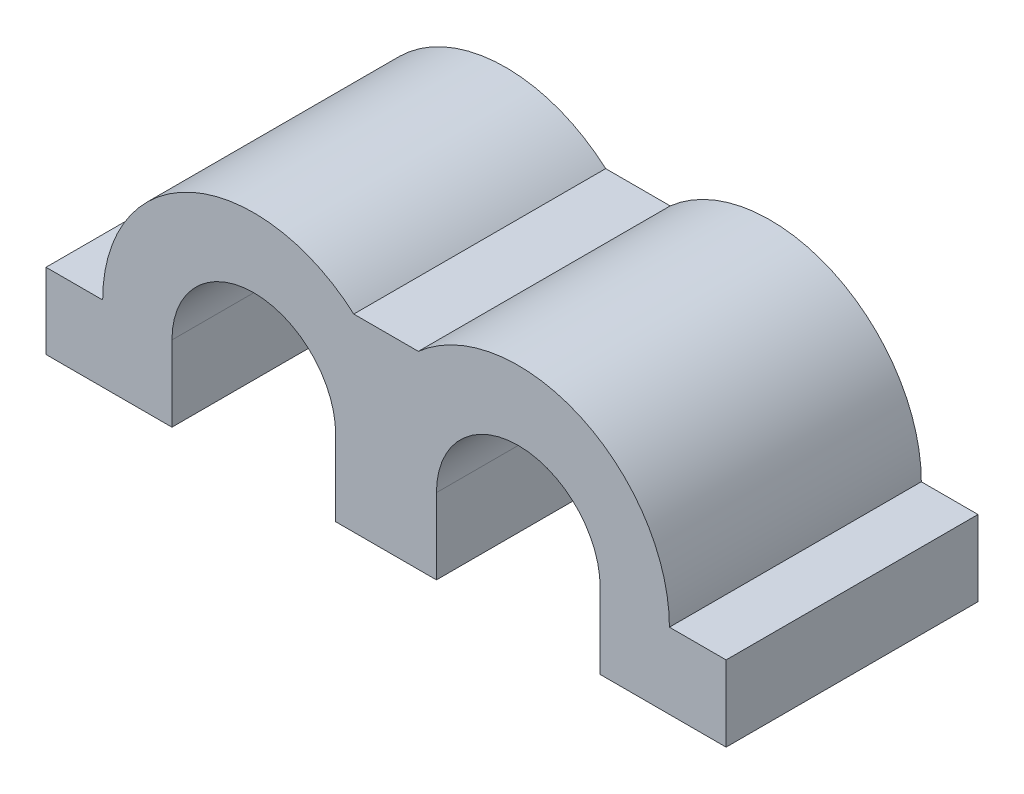
ISO-10303-21;
HEADER;
FILE_DESCRIPTION(('STEP AP214'),'2;1');
FILE_NAME('part.step','',(''),(''),'','','');
FILE_SCHEMA(('AUTOMOTIVE_DESIGN { 1 0 10303 214 1 1 1 1 }'));
ENDSEC;
DATA;
#1=APPLICATION_CONTEXT('core data for automotive mechanical design processes');
#2=APPLICATION_PROTOCOL_DEFINITION('international standard','automotive_design',2000,#1);
#3=PRODUCT_CONTEXT('',#1,'mechanical');
#4=PRODUCT('Part','Part','',(#3));
#5=PRODUCT_RELATED_PRODUCT_CATEGORY('part','',(#4));
#6=PRODUCT_DEFINITION_FORMATION('','',#4);
#7=PRODUCT_DEFINITION_CONTEXT('part definition',#1,'design');
#8=PRODUCT_DEFINITION('design','',#6,#7);
#9=PRODUCT_DEFINITION_SHAPE('','',#8);
#10=(LENGTH_UNIT() NAMED_UNIT(*) SI_UNIT(.MILLI.,.METRE.));
#11=(NAMED_UNIT(*) PLANE_ANGLE_UNIT() SI_UNIT($,.RADIAN.));
#12=(NAMED_UNIT(*) SI_UNIT($,.STERADIAN.) SOLID_ANGLE_UNIT());
#13=UNCERTAINTY_MEASURE_WITH_UNIT(LENGTH_MEASURE(1.E-05),#10,'distance_accuracy_value','');
#14=(GEOMETRIC_REPRESENTATION_CONTEXT(3) GLOBAL_UNCERTAINTY_ASSIGNED_CONTEXT((#13)) GLOBAL_UNIT_ASSIGNED_CONTEXT((#10,
#11,#12)) REPRESENTATION_CONTEXT('',''));
#15=CARTESIAN_POINT('',(0.,0.,0.));
#16=DIRECTION('',(0.,0.,1.));
#17=DIRECTION('',(1.,0.,0.));
#18=AXIS2_PLACEMENT_3D('',#15,#16,#17);
#19=CARTESIAN_POINT('',(5.25,0.,10.));
#20=DIRECTION('',(0.,0.,-1.));
#21=DIRECTION('',(-1.,0.,0.));
#22=AXIS2_PLACEMENT_3D('',#19,#20,#21);
#23=CYLINDRICAL_SURFACE('',#22,6.);
#24=CARTESIAN_POINT('',(5.25,0.,0.));
#25=DIRECTION('',(0.,0.,1.));
#26=DIRECTION('',(1.,0.,0.));
#27=AXIS2_PLACEMENT_3D('',#24,#25,#26);
#28=CIRCLE('',#27,6.);
#29=CARTESIAN_POINT('',(1.28137303340311,4.5,0.));
#30=VERTEX_POINT('',#29);
#31=CARTESIAN_POINT('',(11.25,0.,0.));
#32=VERTEX_POINT('',#31);
#33=EDGE_CURVE('E180',#30,#32,#28,.F.);
#34=ORIENTED_EDGE('',*,*,#33,.F.);
#35=DIRECTION('',(0.,0.,-1.));
#36=VECTOR('',#35,1.);
#37=CARTESIAN_POINT('',(1.28137303340311,4.5,10.));
#38=LINE('',#37,#36);
#39=CARTESIAN_POINT('',(1.28137303340311,4.5,10.));
#40=VERTEX_POINT('',#39);
#41=EDGE_CURVE('E11',#40,#30,#38,.T.);
#42=ORIENTED_EDGE('',*,*,#41,.F.);
#43=CARTESIAN_POINT('',(5.25,0.,10.));
#44=DIRECTION('',(0.,0.,1.));
#45=DIRECTION('',(1.,0.,0.));
#46=AXIS2_PLACEMENT_3D('',#43,#44,#45);
#47=CIRCLE('',#46,6.);
#48=CARTESIAN_POINT('',(11.25,0.,10.));
#49=VERTEX_POINT('',#48);
#50=EDGE_CURVE('E217',#40,#49,#47,.F.);
#51=ORIENTED_EDGE('',*,*,#50,.T.);
#52=DIRECTION('',(0.,0.,-1.));
#53=VECTOR('',#52,1.);
#54=CARTESIAN_POINT('',(11.25,0.,10.));
#55=LINE('',#54,#53);
#56=EDGE_CURVE('E55',#49,#32,#55,.T.);
#57=ORIENTED_EDGE('',*,*,#56,.T.);
#58=EDGE_LOOP('',(#34,#42,#51,#57));
#59=FACE_BOUND('',#58,.T.);
#60=ADVANCED_FACE('F39',(#59),#23,.T.);
#61=CARTESIAN_POINT('',(0.,4.5,10.));
#62=DIRECTION('',(0.,1.,0.));
#63=DIRECTION('',(0.,0.,1.));
#64=AXIS2_PLACEMENT_3D('',#61,#62,#63);
#65=PLANE('',#64);
#66=DIRECTION('',(1.,0.,0.));
#67=VECTOR('',#66,1.);
#68=CARTESIAN_POINT('',(0.,4.5,0.));
#69=LINE('',#68,#67);
#70=CARTESIAN_POINT('',(-1.28137303340311,4.5,0.));
#71=VERTEX_POINT('',#70);
#72=EDGE_CURVE('E182',#71,#30,#69,.T.);
#73=ORIENTED_EDGE('',*,*,#72,.F.);
#74=DIRECTION('',(0.,0.,-1.));
#75=VECTOR('',#74,1.);
#76=CARTESIAN_POINT('',(-1.28137303340311,4.5,10.));
#77=LINE('',#76,#75);
#78=CARTESIAN_POINT('',(-1.28137303340311,4.5,10.));
#79=VERTEX_POINT('',#78);
#80=EDGE_CURVE('E47',#79,#71,#77,.T.);
#81=ORIENTED_EDGE('',*,*,#80,.F.);
#82=DIRECTION('',(1.,0.,0.));
#83=VECTOR('',#82,1.);
#84=CARTESIAN_POINT('',(0.,4.5,10.));
#85=LINE('',#84,#83);
#86=EDGE_CURVE('E261',#79,#40,#85,.T.);
#87=ORIENTED_EDGE('',*,*,#86,.T.);
#88=ORIENTED_EDGE('',*,*,#41,.T.);
#89=EDGE_LOOP('',(#73,#81,#87,#88));
#90=FACE_BOUND('',#89,.T.);
#91=ADVANCED_FACE('F260',(#90),#65,.T.);
#92=CARTESIAN_POINT('',(-5.25,0.,10.));
#93=DIRECTION('',(0.,0.,-1.));
#94=DIRECTION('',(-1.,0.,0.));
#95=AXIS2_PLACEMENT_3D('',#92,#93,#94);
#96=CYLINDRICAL_SURFACE('',#95,6.);
#97=CARTESIAN_POINT('',(-5.25,0.,0.));
#98=DIRECTION('',(0.,0.,1.));
#99=DIRECTION('',(1.,0.,0.));
#100=AXIS2_PLACEMENT_3D('',#97,#98,#99);
#101=CIRCLE('',#100,6.);
#102=CARTESIAN_POINT('',(-11.25,0.,0.));
#103=VERTEX_POINT('',#102);
#104=EDGE_CURVE('E185',#71,#103,#101,.T.);
#105=ORIENTED_EDGE('',*,*,#104,.T.);
#106=DIRECTION('',(0.,0.,-1.));
#107=VECTOR('',#106,1.);
#108=CARTESIAN_POINT('',(-11.25,0.,10.));
#109=LINE('',#108,#107);
#110=CARTESIAN_POINT('',(-11.25,0.,10.));
#111=VERTEX_POINT('',#110);
#112=EDGE_CURVE('E245',#111,#103,#109,.T.);
#113=ORIENTED_EDGE('',*,*,#112,.F.);
#114=CARTESIAN_POINT('',(-5.25,0.,10.));
#115=DIRECTION('',(0.,0.,1.));
#116=DIRECTION('',(1.,0.,0.));
#117=AXIS2_PLACEMENT_3D('',#114,#115,#116);
#118=CIRCLE('',#117,6.);
#119=EDGE_CURVE('E251',#79,#111,#118,.T.);
#120=ORIENTED_EDGE('',*,*,#119,.F.);
#121=ORIENTED_EDGE('',*,*,#80,.T.);
#122=EDGE_LOOP('',(#105,#113,#120,#121));
#123=FACE_BOUND('',#122,.T.);
#124=ADVANCED_FACE('F249',(#123),#96,.T.);
#125=CARTESIAN_POINT('',(0.,0.,10.));
#126=DIRECTION('',(0.,1.,0.));
#127=DIRECTION('',(0.,0.,1.));
#128=AXIS2_PLACEMENT_3D('',#125,#126,#127);
#129=PLANE('',#128);
#130=DIRECTION('',(1.,0.,0.));
#131=VECTOR('',#130,1.);
#132=CARTESIAN_POINT('',(0.,0.,0.));
#133=LINE('',#132,#131);
#134=CARTESIAN_POINT('',(-13.5,0.,0.));
#135=VERTEX_POINT('',#134);
#136=EDGE_CURVE('E188',#135,#103,#133,.T.);
#137=ORIENTED_EDGE('',*,*,#136,.F.);
#138=DIRECTION('',(0.,0.,-1.));
#139=VECTOR('',#138,1.);
#140=CARTESIAN_POINT('',(-13.5,0.,10.));
#141=LINE('',#140,#139);
#142=CARTESIAN_POINT('',(-13.5,0.,10.));
#143=VERTEX_POINT('',#142);
#144=EDGE_CURVE('E243',#143,#135,#141,.T.);
#145=ORIENTED_EDGE('',*,*,#144,.F.);
#146=DIRECTION('',(1.,0.,0.));
#147=VECTOR('',#146,1.);
#148=CARTESIAN_POINT('',(0.,0.,10.));
#149=LINE('',#148,#147);
#150=EDGE_CURVE('E468',#143,#111,#149,.T.);
#151=ORIENTED_EDGE('',*,*,#150,.T.);
#152=ORIENTED_EDGE('',*,*,#112,.T.);
#153=EDGE_LOOP('',(#137,#145,#151,#152));
#154=FACE_BOUND('',#153,.T.);
#155=ADVANCED_FACE('F279',(#154),#129,.T.);
#156=CARTESIAN_POINT('',(-13.5,0.,10.));
#157=DIRECTION('',(1.,0.,0.));
#158=DIRECTION('',(0.,0.,-1.));
#159=AXIS2_PLACEMENT_3D('',#156,#157,#158);
#160=PLANE('',#159);
#161=DIRECTION('',(0.,-1.,0.));
#162=VECTOR('',#161,1.);
#163=CARTESIAN_POINT('',(-13.5,0.,0.));
#164=LINE('',#163,#162);
#165=CARTESIAN_POINT('',(-13.5,-3.,0.));
#166=VERTEX_POINT('',#165);
#167=EDGE_CURVE('E191',#135,#166,#164,.T.);
#168=ORIENTED_EDGE('',*,*,#167,.T.);
#169=DIRECTION('',(0.,0.,-1.));
#170=VECTOR('',#169,1.);
#171=CARTESIAN_POINT('',(-13.5,-3.,10.));
#172=LINE('',#171,#170);
#173=CARTESIAN_POINT('',(-13.5,-3.,10.));
#174=VERTEX_POINT('',#173);
#175=EDGE_CURVE('E240',#174,#166,#172,.T.);
#176=ORIENTED_EDGE('',*,*,#175,.F.);
#177=DIRECTION('',(0.,-1.,0.));
#178=VECTOR('',#177,1.);
#179=CARTESIAN_POINT('',(-13.5,0.,10.));
#180=LINE('',#179,#178);
#181=EDGE_CURVE('E465',#143,#174,#180,.T.);
#182=ORIENTED_EDGE('',*,*,#181,.F.);
#183=ORIENTED_EDGE('',*,*,#144,.T.);
#184=EDGE_LOOP('',(#168,#176,#182,#183));
#185=FACE_BOUND('',#184,.T.);
#186=ADVANCED_FACE('F284',(#185),#160,.F.);
#187=CARTESIAN_POINT('',(0.,-3.,10.));
#188=DIRECTION('',(0.,1.,0.));
#189=DIRECTION('',(0.,0.,1.));
#190=AXIS2_PLACEMENT_3D('',#187,#188,#189);
#191=PLANE('',#190);
#192=DIRECTION('',(1.,0.,0.));
#193=VECTOR('',#192,1.);
#194=CARTESIAN_POINT('',(0.,-3.,0.));
#195=LINE('',#194,#193);
#196=CARTESIAN_POINT('',(-8.5,-3.,0.));
#197=VERTEX_POINT('',#196);
#198=EDGE_CURVE('E193',#166,#197,#195,.T.);
#199=ORIENTED_EDGE('',*,*,#198,.T.);
#200=DIRECTION('',(0.,0.,-1.));
#201=VECTOR('',#200,1.);
#202=CARTESIAN_POINT('',(-8.5,-3.,10.));
#203=LINE('',#202,#201);
#204=CARTESIAN_POINT('',(-8.5,-3.,10.));
#205=VERTEX_POINT('',#204);
#206=EDGE_CURVE('E238',#205,#197,#203,.T.);
#207=ORIENTED_EDGE('',*,*,#206,.F.);
#208=DIRECTION('',(1.,0.,0.));
#209=VECTOR('',#208,1.);
#210=CARTESIAN_POINT('',(0.,-3.,10.));
#211=LINE('',#210,#209);
#212=EDGE_CURVE('E463',#174,#205,#211,.T.);
#213=ORIENTED_EDGE('',*,*,#212,.F.);
#214=ORIENTED_EDGE('',*,*,#175,.T.);
#215=EDGE_LOOP('',(#199,#207,#213,#214));
#216=FACE_BOUND('',#215,.T.);
#217=ADVANCED_FACE('F288',(#216),#191,.F.);
#218=CARTESIAN_POINT('',(-8.5,0.,10.));
#219=DIRECTION('',(1.,0.,0.));
#220=DIRECTION('',(0.,0.,-1.));
#221=AXIS2_PLACEMENT_3D('',#218,#219,#220);
#222=PLANE('',#221);
#223=DIRECTION('',(0.,-1.,0.));
#224=VECTOR('',#223,1.);
#225=CARTESIAN_POINT('',(-8.5,0.,0.));
#226=LINE('',#225,#224);
#227=CARTESIAN_POINT('',(-8.5,0.,0.));
#228=VERTEX_POINT('',#227);
#229=EDGE_CURVE('E196',#228,#197,#226,.T.);
#230=ORIENTED_EDGE('',*,*,#229,.F.);
#231=DIRECTION('',(0.,0.,-1.));
#232=VECTOR('',#231,1.);
#233=CARTESIAN_POINT('',(-8.5,0.,10.));
#234=LINE('',#233,#232);
#235=CARTESIAN_POINT('',(-8.5,0.,10.));
#236=VERTEX_POINT('',#235);
#237=EDGE_CURVE('E236',#236,#228,#234,.T.);
#238=ORIENTED_EDGE('',*,*,#237,.F.);
#239=DIRECTION('',(0.,-1.,0.));
#240=VECTOR('',#239,1.);
#241=CARTESIAN_POINT('',(-8.5,0.,10.));
#242=LINE('',#241,#240);
#243=EDGE_CURVE('E458',#236,#205,#242,.T.);
#244=ORIENTED_EDGE('',*,*,#243,.T.);
#245=ORIENTED_EDGE('',*,*,#206,.T.);
#246=EDGE_LOOP('',(#230,#238,#244,#245));
#247=FACE_BOUND('',#246,.T.);
#248=ADVANCED_FACE('F292',(#247),#222,.T.);
#249=CARTESIAN_POINT('',(-5.25,0.,10.));
#250=DIRECTION('',(0.,0.,-1.));
#251=DIRECTION('',(-1.,0.,0.));
#252=AXIS2_PLACEMENT_3D('',#249,#250,#251);
#253=CYLINDRICAL_SURFACE('',#252,3.25);
#254=CARTESIAN_POINT('',(-5.25,0.,0.));
#255=DIRECTION('',(0.,0.,1.));
#256=DIRECTION('',(1.,0.,0.));
#257=AXIS2_PLACEMENT_3D('',#254,#255,#256);
#258=CIRCLE('',#257,3.25);
#259=CARTESIAN_POINT('',(-2.,0.,0.));
#260=VERTEX_POINT('',#259);
#261=EDGE_CURVE('E199',#228,#260,#258,.F.);
#262=ORIENTED_EDGE('',*,*,#261,.T.);
#263=DIRECTION('',(0.,0.,-1.));
#264=VECTOR('',#263,1.);
#265=CARTESIAN_POINT('',(-2.,0.,10.));
#266=LINE('',#265,#264);
#267=CARTESIAN_POINT('',(-2.,0.,10.));
#268=VERTEX_POINT('',#267);
#269=EDGE_CURVE('E233',#268,#260,#266,.T.);
#270=ORIENTED_EDGE('',*,*,#269,.F.);
#271=CARTESIAN_POINT('',(-5.25,0.,10.));
#272=DIRECTION('',(0.,0.,1.));
#273=DIRECTION('',(1.,0.,0.));
#274=AXIS2_PLACEMENT_3D('',#271,#272,#273);
#275=CIRCLE('',#274,3.25);
#276=EDGE_CURVE('E455',#236,#268,#275,.F.);
#277=ORIENTED_EDGE('',*,*,#276,.F.);
#278=ORIENTED_EDGE('',*,*,#237,.T.);
#279=EDGE_LOOP('',(#262,#270,#277,#278));
#280=FACE_BOUND('',#279,.T.);
#281=ADVANCED_FACE('F296',(#280),#253,.F.);
#282=CARTESIAN_POINT('',(-2.,0.,10.));
#283=DIRECTION('',(1.,0.,0.));
#284=DIRECTION('',(0.,0.,-1.));
#285=AXIS2_PLACEMENT_3D('',#282,#283,#284);
#286=PLANE('',#285);
#287=DIRECTION('',(0.,-1.,0.));
#288=VECTOR('',#287,1.);
#289=CARTESIAN_POINT('',(-2.,0.,0.));
#290=LINE('',#289,#288);
#291=CARTESIAN_POINT('',(-2.,-3.,0.));
#292=VERTEX_POINT('',#291);
#293=EDGE_CURVE('E201',#260,#292,#290,.T.);
#294=ORIENTED_EDGE('',*,*,#293,.T.);
#295=DIRECTION('',(0.,0.,-1.));
#296=VECTOR('',#295,1.);
#297=CARTESIAN_POINT('',(-2.,-3.,10.));
#298=LINE('',#297,#296);
#299=CARTESIAN_POINT('',(-2.,-3.,10.));
#300=VERTEX_POINT('',#299);
#301=EDGE_CURVE('E230',#300,#292,#298,.T.);
#302=ORIENTED_EDGE('',*,*,#301,.F.);
#303=DIRECTION('',(0.,-1.,0.));
#304=VECTOR('',#303,1.);
#305=CARTESIAN_POINT('',(-2.,0.,10.));
#306=LINE('',#305,#304);
#307=EDGE_CURVE('E453',#268,#300,#306,.T.);
#308=ORIENTED_EDGE('',*,*,#307,.F.);
#309=ORIENTED_EDGE('',*,*,#269,.T.);
#310=EDGE_LOOP('',(#294,#302,#308,#309));
#311=FACE_BOUND('',#310,.T.);
#312=ADVANCED_FACE('F300',(#311),#286,.F.);
#313=CARTESIAN_POINT('',(0.,-3.,10.));
#314=DIRECTION('',(0.,1.,0.));
#315=DIRECTION('',(0.,0.,1.));
#316=AXIS2_PLACEMENT_3D('',#313,#314,#315);
#317=PLANE('',#316);
#318=DIRECTION('',(1.,0.,0.));
#319=VECTOR('',#318,1.);
#320=CARTESIAN_POINT('',(0.,-3.,0.));
#321=LINE('',#320,#319);
#322=CARTESIAN_POINT('',(2.,-3.,0.));
#323=VERTEX_POINT('',#322);
#324=EDGE_CURVE('E203',#292,#323,#321,.T.);
#325=ORIENTED_EDGE('',*,*,#324,.T.);
#326=DIRECTION('',(0.,0.,-1.));
#327=VECTOR('',#326,1.);
#328=CARTESIAN_POINT('',(2.,-3.,10.));
#329=LINE('',#328,#327);
#330=CARTESIAN_POINT('',(2.,-3.,10.));
#331=VERTEX_POINT('',#330);
#332=EDGE_CURVE('E227',#331,#323,#329,.T.);
#333=ORIENTED_EDGE('',*,*,#332,.F.);
#334=DIRECTION('',(1.,0.,0.));
#335=VECTOR('',#334,1.);
#336=CARTESIAN_POINT('',(0.,-3.,10.));
#337=LINE('',#336,#335);
#338=EDGE_CURVE('E446',#300,#331,#337,.T.);
#339=ORIENTED_EDGE('',*,*,#338,.F.);
#340=ORIENTED_EDGE('',*,*,#301,.T.);
#341=EDGE_LOOP('',(#325,#333,#339,#340));
#342=FACE_BOUND('',#341,.T.);
#343=ADVANCED_FACE('F304',(#342),#317,.F.);
#344=CARTESIAN_POINT('',(2.,0.,10.));
#345=DIRECTION('',(-1.,0.,0.));
#346=DIRECTION('',(0.,0.,1.));
#347=AXIS2_PLACEMENT_3D('',#344,#345,#346);
#348=PLANE('',#347);
#349=DIRECTION('',(0.,1.,0.));
#350=VECTOR('',#349,1.);
#351=CARTESIAN_POINT('',(2.,0.,0.));
#352=LINE('',#351,#350);
#353=CARTESIAN_POINT('',(2.,0.,0.));
#354=VERTEX_POINT('',#353);
#355=EDGE_CURVE('E205',#323,#354,#352,.T.);
#356=ORIENTED_EDGE('',*,*,#355,.T.);
#357=DIRECTION('',(0.,0.,-1.));
#358=VECTOR('',#357,1.);
#359=CARTESIAN_POINT('',(2.,0.,10.));
#360=LINE('',#359,#358);
#361=CARTESIAN_POINT('',(2.,0.,10.));
#362=VERTEX_POINT('',#361);
#363=EDGE_CURVE('E224',#362,#354,#360,.T.);
#364=ORIENTED_EDGE('',*,*,#363,.F.);
#365=DIRECTION('',(0.,1.,0.));
#366=VECTOR('',#365,1.);
#367=CARTESIAN_POINT('',(2.,0.,10.));
#368=LINE('',#367,#366);
#369=EDGE_CURVE('E443',#331,#362,#368,.T.);
#370=ORIENTED_EDGE('',*,*,#369,.F.);
#371=ORIENTED_EDGE('',*,*,#332,.T.);
#372=EDGE_LOOP('',(#356,#364,#370,#371));
#373=FACE_BOUND('',#372,.T.);
#374=ADVANCED_FACE('F308',(#373),#348,.F.);
#375=CARTESIAN_POINT('',(5.25,0.,10.));
#376=DIRECTION('',(0.,0.,-1.));
#377=DIRECTION('',(-1.,0.,0.));
#378=AXIS2_PLACEMENT_3D('',#375,#376,#377);
#379=CYLINDRICAL_SURFACE('',#378,3.25);
#380=CARTESIAN_POINT('',(5.25,0.,0.));
#381=DIRECTION('',(0.,0.,1.));
#382=DIRECTION('',(1.,0.,0.));
#383=AXIS2_PLACEMENT_3D('',#380,#381,#382);
#384=CIRCLE('',#383,3.25);
#385=CARTESIAN_POINT('',(8.5,0.,0.));
#386=VERTEX_POINT('',#385);
#387=EDGE_CURVE('E207',#354,#386,#384,.F.);
#388=ORIENTED_EDGE('',*,*,#387,.T.);
#389=DIRECTION('',(0.,0.,-1.));
#390=VECTOR('',#389,1.);
#391=CARTESIAN_POINT('',(8.5,0.,10.));
#392=LINE('',#391,#390);
#393=CARTESIAN_POINT('',(8.5,0.,10.));
#394=VERTEX_POINT('',#393);
#395=EDGE_CURVE('E221',#394,#386,#392,.T.);
#396=ORIENTED_EDGE('',*,*,#395,.F.);
#397=CARTESIAN_POINT('',(5.25,0.,10.));
#398=DIRECTION('',(0.,0.,1.));
#399=DIRECTION('',(1.,0.,0.));
#400=AXIS2_PLACEMENT_3D('',#397,#398,#399);
#401=CIRCLE('',#400,3.25);
#402=EDGE_CURVE('E441',#362,#394,#401,.F.);
#403=ORIENTED_EDGE('',*,*,#402,.F.);
#404=ORIENTED_EDGE('',*,*,#363,.T.);
#405=EDGE_LOOP('',(#388,#396,#403,#404));
#406=FACE_BOUND('',#405,.T.);
#407=ADVANCED_FACE('F312',(#406),#379,.F.);
#408=CARTESIAN_POINT('',(8.5,0.,10.));
#409=DIRECTION('',(1.,0.,0.));
#410=DIRECTION('',(0.,0.,-1.));
#411=AXIS2_PLACEMENT_3D('',#408,#409,#410);
#412=PLANE('',#411);
#413=DIRECTION('',(0.,-1.,0.));
#414=VECTOR('',#413,1.);
#415=CARTESIAN_POINT('',(8.5,0.,0.));
#416=LINE('',#415,#414);
#417=CARTESIAN_POINT('',(8.5,-3.,0.));
#418=VERTEX_POINT('',#417);
#419=EDGE_CURVE('E209',#386,#418,#416,.T.);
#420=ORIENTED_EDGE('',*,*,#419,.T.);
#421=DIRECTION('',(0.,0.,-1.));
#422=VECTOR('',#421,1.);
#423=CARTESIAN_POINT('',(8.5,-3.,10.));
#424=LINE('',#423,#422);
#425=CARTESIAN_POINT('',(8.5,-3.,10.));
#426=VERTEX_POINT('',#425);
#427=EDGE_CURVE('E172',#426,#418,#424,.T.);
#428=ORIENTED_EDGE('',*,*,#427,.F.);
#429=DIRECTION('',(0.,-1.,0.));
#430=VECTOR('',#429,1.);
#431=CARTESIAN_POINT('',(8.5,0.,10.));
#432=LINE('',#431,#430);
#433=EDGE_CURVE('E160',#394,#426,#432,.T.);
#434=ORIENTED_EDGE('',*,*,#433,.F.);
#435=ORIENTED_EDGE('',*,*,#395,.T.);
#436=EDGE_LOOP('',(#420,#428,#434,#435));
#437=FACE_BOUND('',#436,.T.);
#438=ADVANCED_FACE('F316',(#437),#412,.F.);
#439=CARTESIAN_POINT('',(0.,-3.,10.));
#440=DIRECTION('',(0.,1.,0.));
#441=DIRECTION('',(0.,0.,1.));
#442=AXIS2_PLACEMENT_3D('',#439,#440,#441);
#443=PLANE('',#442);
#444=DIRECTION('',(1.,0.,0.));
#445=VECTOR('',#444,1.);
#446=CARTESIAN_POINT('',(0.,-3.,0.));
#447=LINE('',#446,#445);
#448=CARTESIAN_POINT('',(13.5,-3.,0.));
#449=VERTEX_POINT('',#448);
#450=EDGE_CURVE('E169',#418,#449,#447,.T.);
#451=ORIENTED_EDGE('',*,*,#450,.T.);
#452=DIRECTION('',(0.,0.,-1.));
#453=VECTOR('',#452,1.);
#454=CARTESIAN_POINT('',(13.5,-3.,10.));
#455=LINE('',#454,#453);
#456=CARTESIAN_POINT('',(13.5,-3.,10.));
#457=VERTEX_POINT('',#456);
#458=EDGE_CURVE('E166',#457,#449,#455,.T.);
#459=ORIENTED_EDGE('',*,*,#458,.F.);
#460=DIRECTION('',(1.,0.,0.));
#461=VECTOR('',#460,1.);
#462=CARTESIAN_POINT('',(0.,-3.,10.));
#463=LINE('',#462,#461);
#464=EDGE_CURVE('E153',#426,#457,#463,.T.);
#465=ORIENTED_EDGE('',*,*,#464,.F.);
#466=ORIENTED_EDGE('',*,*,#427,.T.);
#467=EDGE_LOOP('',(#451,#459,#465,#466));
#468=FACE_BOUND('',#467,.T.);
#469=ADVANCED_FACE('F167',(#468),#443,.F.);
#470=CARTESIAN_POINT('',(13.5,0.,10.));
#471=DIRECTION('',(-1.,0.,0.));
#472=DIRECTION('',(0.,0.,1.));
#473=AXIS2_PLACEMENT_3D('',#470,#471,#472);
#474=PLANE('',#473);
#475=DIRECTION('',(0.,1.,0.));
#476=VECTOR('',#475,1.);
#477=CARTESIAN_POINT('',(13.5,0.,0.));
#478=LINE('',#477,#476);
#479=CARTESIAN_POINT('',(13.5,0.,0.));
#480=VERTEX_POINT('',#479);
#481=EDGE_CURVE('E212',#449,#480,#478,.T.);
#482=ORIENTED_EDGE('',*,*,#481,.T.);
#483=DIRECTION('',(0.,0.,-1.));
#484=VECTOR('',#483,1.);
#485=CARTESIAN_POINT('',(13.5,0.,10.));
#486=LINE('',#485,#484);
#487=CARTESIAN_POINT('',(13.5,0.,10.));
#488=VERTEX_POINT('',#487);
#489=EDGE_CURVE('E105',#488,#480,#486,.T.);
#490=ORIENTED_EDGE('',*,*,#489,.F.);
#491=DIRECTION('',(0.,1.,0.));
#492=VECTOR('',#491,1.);
#493=CARTESIAN_POINT('',(13.5,0.,10.));
#494=LINE('',#493,#492);
#495=EDGE_CURVE('E158',#457,#488,#494,.T.);
#496=ORIENTED_EDGE('',*,*,#495,.F.);
#497=ORIENTED_EDGE('',*,*,#458,.T.);
#498=EDGE_LOOP('',(#482,#490,#496,#497));
#499=FACE_BOUND('',#498,.T.);
#500=ADVANCED_FACE('F174',(#499),#474,.F.);
#501=CARTESIAN_POINT('',(0.,0.,10.));
#502=DIRECTION('',(0.,1.,0.));
#503=DIRECTION('',(0.,0.,1.));
#504=AXIS2_PLACEMENT_3D('',#501,#502,#503);
#505=PLANE('',#504);
#506=DIRECTION('',(1.,0.,0.));
#507=VECTOR('',#506,1.);
#508=CARTESIAN_POINT('',(0.,0.,0.));
#509=LINE('',#508,#507);
#510=EDGE_CURVE('E214',#32,#480,#509,.T.);
#511=ORIENTED_EDGE('',*,*,#510,.F.);
#512=ORIENTED_EDGE('',*,*,#56,.F.);
#513=DIRECTION('',(1.,0.,0.));
#514=VECTOR('',#513,1.);
#515=CARTESIAN_POINT('',(0.,0.,10.));
#516=LINE('',#515,#514);
#517=EDGE_CURVE('E175',#49,#488,#516,.T.);
#518=ORIENTED_EDGE('',*,*,#517,.T.);
#519=ORIENTED_EDGE('',*,*,#489,.T.);
#520=EDGE_LOOP('',(#511,#512,#518,#519));
#521=FACE_BOUND('',#520,.T.);
#522=ADVANCED_FACE('F262',(#521),#505,.T.);
#523=CARTESIAN_POINT('',(0.,0.,10.));
#524=DIRECTION('',(0.,0.,1.));
#525=DIRECTION('',(1.,0.,0.));
#526=AXIS2_PLACEMENT_3D('',#523,#524,#525);
#527=PLANE('',#526);
#528=ORIENTED_EDGE('',*,*,#50,.F.);
#529=ORIENTED_EDGE('',*,*,#86,.F.);
#530=ORIENTED_EDGE('',*,*,#119,.T.);
#531=ORIENTED_EDGE('',*,*,#150,.F.);
#532=ORIENTED_EDGE('',*,*,#181,.T.);
#533=ORIENTED_EDGE('',*,*,#212,.T.);
#534=ORIENTED_EDGE('',*,*,#243,.F.);
#535=ORIENTED_EDGE('',*,*,#276,.T.);
#536=ORIENTED_EDGE('',*,*,#307,.T.);
#537=ORIENTED_EDGE('',*,*,#338,.T.);
#538=ORIENTED_EDGE('',*,*,#369,.T.);
#539=ORIENTED_EDGE('',*,*,#402,.T.);
#540=ORIENTED_EDGE('',*,*,#433,.T.);
#541=ORIENTED_EDGE('',*,*,#464,.T.);
#542=ORIENTED_EDGE('',*,*,#495,.T.);
#543=ORIENTED_EDGE('',*,*,#517,.F.);
#544=EDGE_LOOP('',(#528,#529,#530,#531,#532,#533,#534,#535,#536,#537,#538,#539,#540,#541,#542,#543));
#545=FACE_BOUND('',#544,.T.);
#546=ADVANCED_FACE('F155',(#545),#527,.T.);
#547=CARTESIAN_POINT('',(0.,0.,0.));
#548=DIRECTION('',(0.,0.,1.));
#549=DIRECTION('',(1.,0.,0.));
#550=AXIS2_PLACEMENT_3D('',#547,#548,#549);
#551=PLANE('',#550);
#552=ORIENTED_EDGE('',*,*,#33,.T.);
#553=ORIENTED_EDGE('',*,*,#510,.T.);
#554=ORIENTED_EDGE('',*,*,#481,.F.);
#555=ORIENTED_EDGE('',*,*,#450,.F.);
#556=ORIENTED_EDGE('',*,*,#419,.F.);
#557=ORIENTED_EDGE('',*,*,#387,.F.);
#558=ORIENTED_EDGE('',*,*,#355,.F.);
#559=ORIENTED_EDGE('',*,*,#324,.F.);
#560=ORIENTED_EDGE('',*,*,#293,.F.);
#561=ORIENTED_EDGE('',*,*,#261,.F.);
#562=ORIENTED_EDGE('',*,*,#229,.T.);
#563=ORIENTED_EDGE('',*,*,#198,.F.);
#564=ORIENTED_EDGE('',*,*,#167,.F.);
#565=ORIENTED_EDGE('',*,*,#136,.T.);
#566=ORIENTED_EDGE('',*,*,#104,.F.);
#567=ORIENTED_EDGE('',*,*,#72,.T.);
#568=EDGE_LOOP('',(#552,#553,#554,#555,#556,#557,#558,#559,#560,#561,#562,#563,#564,#565,#566,#567));
#569=FACE_BOUND('',#568,.T.);
#570=ADVANCED_FACE('F257',(#569),#551,.F.);
#571=CLOSED_SHELL('',(#60,#91,#124,#155,#186,#217,#248,#281,#312,#343,#374,#407,#438,#469,#500,
#522,#546,#570));
#572=MANIFOLD_SOLID_BREP('B2',#571);
#573=ADVANCED_BREP_SHAPE_REPRESENTATION('',(#18,#572),#14);
#574=SHAPE_DEFINITION_REPRESENTATION(#9,#573);
ENDSEC;
END-ISO-10303-21;
